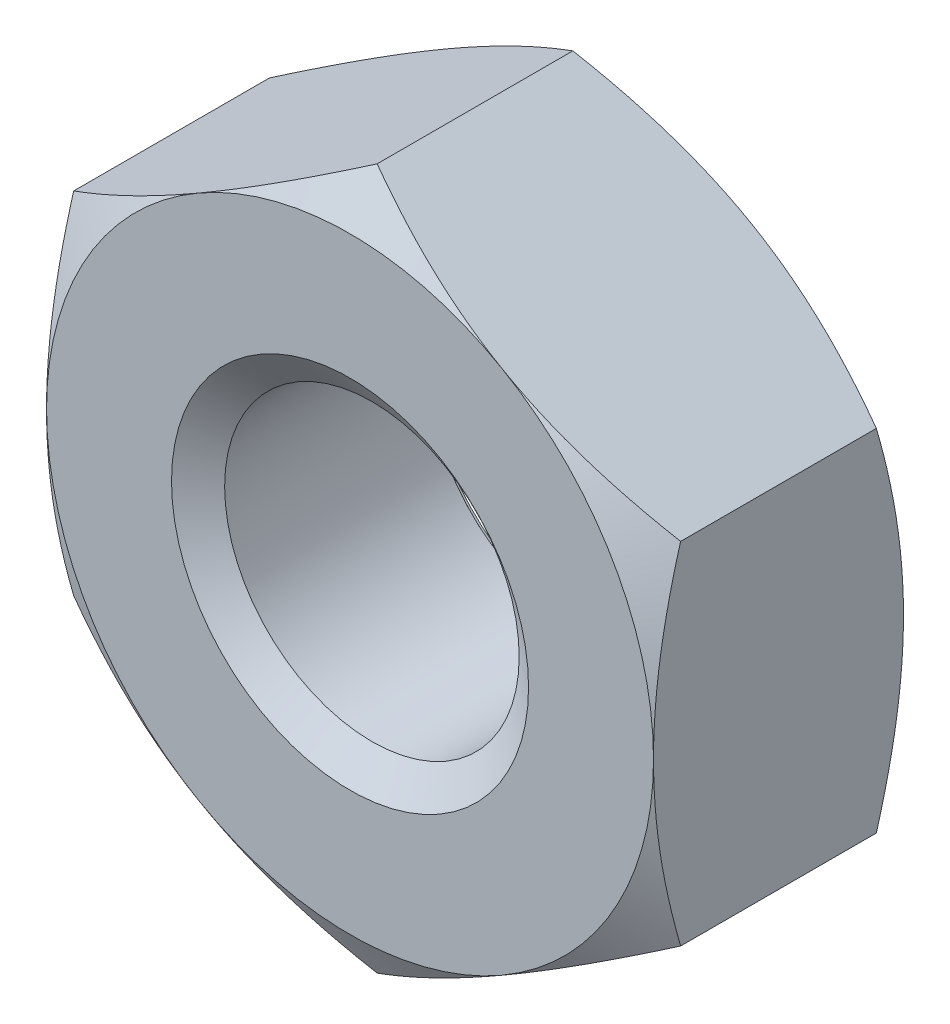
ISO-10303-21;
HEADER;
FILE_DESCRIPTION(('STEP AP214'),'2;1');
FILE_NAME('part.step','',(''),(''),'','','');
FILE_SCHEMA(('AUTOMOTIVE_DESIGN { 1 0 10303 214 1 1 1 1 }'));
ENDSEC;
DATA;
#1=APPLICATION_CONTEXT('core data for automotive mechanical design processes');
#2=APPLICATION_PROTOCOL_DEFINITION('international standard','automotive_design',2000,#1);
#3=PRODUCT_CONTEXT('',#1,'mechanical');
#4=PRODUCT('Part','Part','',(#3));
#5=PRODUCT_RELATED_PRODUCT_CATEGORY('part','',(#4));
#6=PRODUCT_DEFINITION_FORMATION('','',#4);
#7=PRODUCT_DEFINITION_CONTEXT('part definition',#1,'design');
#8=PRODUCT_DEFINITION('design','',#6,#7);
#9=PRODUCT_DEFINITION_SHAPE('','',#8);
#10=(LENGTH_UNIT() NAMED_UNIT(*) SI_UNIT(.MILLI.,.METRE.));
#11=(NAMED_UNIT(*) PLANE_ANGLE_UNIT() SI_UNIT($,.RADIAN.));
#12=(NAMED_UNIT(*) SI_UNIT($,.STERADIAN.) SOLID_ANGLE_UNIT());
#13=UNCERTAINTY_MEASURE_WITH_UNIT(LENGTH_MEASURE(1.E-05),#10,'distance_accuracy_value','');
#14=(GEOMETRIC_REPRESENTATION_CONTEXT(3) GLOBAL_UNCERTAINTY_ASSIGNED_CONTEXT((#13)) GLOBAL_UNIT_ASSIGNED_CONTEXT((#10,
#11,#12)) REPRESENTATION_CONTEXT('',''));
#15=CARTESIAN_POINT('',(0.,0.,0.));
#16=DIRECTION('',(0.,0.,1.));
#17=DIRECTION('',(1.,0.,0.));
#18=AXIS2_PLACEMENT_3D('',#15,#16,#17);
#19=CARTESIAN_POINT('',(0.,3.92598183048946,-2.8));
#20=DIRECTION('',(0.,0.,-1.));
#21=DIRECTION('',(-1.,0.,0.));
#22=AXIS2_PLACEMENT_3D('',#19,#20,#21);
#23=PLANE('',#22);
#24=CARTESIAN_POINT('',(0.,0.,-2.8));
#25=DIRECTION('',(0.,0.,-1.));
#26=DIRECTION('',(-1.,0.,0.));
#27=AXIS2_PLACEMENT_3D('',#24,#25,#26);
#28=CIRCLE('',#27,2.);
#29=CARTESIAN_POINT('',(-2.,0.,-2.8));
#30=VERTEX_POINT('',#29);
#31=EDGE_CURVE('E698',#30,#30,#28,.T.);
#32=ORIENTED_EDGE('',*,*,#31,.F.);
#33=EDGE_LOOP('',(#32));
#34=FACE_BOUND('',#33,.T.);
#35=CARTESIAN_POINT('',(0.,0.,-2.8));
#36=DIRECTION('',(0.,0.,-1.));
#37=DIRECTION('',(-1.,0.,0.));
#38=AXIS2_PLACEMENT_3D('',#35,#36,#37);
#39=CIRCLE('',#38,3.4);
#40=CARTESIAN_POINT('',(-3.4,0.,-2.8));
#41=VERTEX_POINT('',#40);
#42=CARTESIAN_POINT('',(-1.7,-2.94448637286709,-2.8));
#43=VERTEX_POINT('',#42);
#44=EDGE_CURVE('E185',#41,#43,#39,.F.);
#45=ORIENTED_EDGE('',*,*,#44,.F.);
#46=CARTESIAN_POINT('',(-1.7,2.94448637286709,-2.8));
#47=VERTEX_POINT('',#46);
#48=EDGE_CURVE('E160',#47,#41,#39,.F.);
#49=ORIENTED_EDGE('',*,*,#48,.F.);
#50=CARTESIAN_POINT('',(1.7,2.94448637286709,-2.8));
#51=VERTEX_POINT('',#50);
#52=EDGE_CURVE('E653',#51,#47,#39,.F.);
#53=ORIENTED_EDGE('',*,*,#52,.F.);
#54=CARTESIAN_POINT('',(0.,0.,-2.8));
#55=DIRECTION('',(0.,0.,1.));
#56=DIRECTION('',(1.,0.,0.));
#57=AXIS2_PLACEMENT_3D('',#54,#55,#56);
#58=CIRCLE('',#57,3.4);
#59=CARTESIAN_POINT('',(3.4,0.,-2.8));
#60=VERTEX_POINT('',#59);
#61=EDGE_CURVE('E651',#60,#51,#58,.T.);
#62=ORIENTED_EDGE('',*,*,#61,.F.);
#63=CARTESIAN_POINT('',(1.7,-2.94448637286709,-2.8));
#64=VERTEX_POINT('',#63);
#65=EDGE_CURVE('E645',#64,#60,#39,.F.);
#66=ORIENTED_EDGE('',*,*,#65,.F.);
#67=EDGE_CURVE('E648',#43,#64,#39,.F.);
#68=ORIENTED_EDGE('',*,*,#67,.F.);
#69=EDGE_LOOP('',(#45,#49,#53,#62,#66,#68));
#70=FACE_BOUND('',#69,.T.);
#71=ADVANCED_FACE('F39',(#34,#70),#23,.T.);
#72=CARTESIAN_POINT('',(0.,3.92598183048946,0.));
#73=DIRECTION('',(0.,0.,-1.));
#74=DIRECTION('',(-1.,0.,0.));
#75=AXIS2_PLACEMENT_3D('',#72,#73,#74);
#76=PLANE('',#75);
#77=CARTESIAN_POINT('',(0.,0.,0.));
#78=DIRECTION('',(0.,0.,-1.));
#79=DIRECTION('',(-1.,0.,0.));
#80=AXIS2_PLACEMENT_3D('',#77,#78,#79);
#81=CIRCLE('',#80,2.00000000000002);
#82=CARTESIAN_POINT('',(-2.00000000000002,0.,0.));
#83=VERTEX_POINT('',#82);
#84=EDGE_CURVE('E47',#83,#83,#81,.T.);
#85=ORIENTED_EDGE('',*,*,#84,.T.);
#86=EDGE_LOOP('',(#85));
#87=FACE_BOUND('',#86,.T.);
#88=CARTESIAN_POINT('',(0.,0.,0.));
#89=DIRECTION('',(0.,0.,-1.));
#90=DIRECTION('',(-1.,0.,0.));
#91=AXIS2_PLACEMENT_3D('',#88,#89,#90);
#92=CIRCLE('',#91,3.4);
#93=CARTESIAN_POINT('',(-3.4,0.,0.));
#94=VERTEX_POINT('',#93);
#95=CARTESIAN_POINT('',(-1.7,2.94448637286709,0.));
#96=VERTEX_POINT('',#95);
#97=EDGE_CURVE('E186',#94,#96,#92,.T.);
#98=ORIENTED_EDGE('',*,*,#97,.F.);
#99=CARTESIAN_POINT('',(-1.7,-2.94448637286709,0.));
#100=VERTEX_POINT('',#99);
#101=EDGE_CURVE('E179',#100,#94,#92,.T.);
#102=ORIENTED_EDGE('',*,*,#101,.F.);
#103=CARTESIAN_POINT('',(1.7,-2.94448637286709,0.));
#104=VERTEX_POINT('',#103);
#105=EDGE_CURVE('E184',#104,#100,#92,.T.);
#106=ORIENTED_EDGE('',*,*,#105,.F.);
#107=CARTESIAN_POINT('',(3.4,0.,0.));
#108=VERTEX_POINT('',#107);
#109=EDGE_CURVE('E709',#108,#104,#92,.T.);
#110=ORIENTED_EDGE('',*,*,#109,.F.);
#111=CARTESIAN_POINT('',(0.,0.,0.));
#112=DIRECTION('',(0.,0.,1.));
#113=DIRECTION('',(1.,0.,0.));
#114=AXIS2_PLACEMENT_3D('',#111,#112,#113);
#115=CIRCLE('',#114,3.4);
#116=CARTESIAN_POINT('',(1.7,2.94448637286709,0.));
#117=VERTEX_POINT('',#116);
#118=EDGE_CURVE('E130',#108,#117,#115,.T.);
#119=ORIENTED_EDGE('',*,*,#118,.T.);
#120=EDGE_CURVE('E706',#96,#117,#92,.T.);
#121=ORIENTED_EDGE('',*,*,#120,.F.);
#122=EDGE_LOOP('',(#98,#102,#106,#110,#119,#121));
#123=FACE_BOUND('',#122,.T.);
#124=ADVANCED_FACE('F306',(#87,#123),#76,.F.);
#125=CARTESIAN_POINT('',(0.,3.92598183048946,-2.8));
#126=DIRECTION('',(-0.5,0.866025403784438,0.));
#127=DIRECTION('',(-0.866025403784438,-0.5,0.));
#128=AXIS2_PLACEMENT_3D('',#125,#126,#127);
#129=PLANE('',#128);
#130=DIRECTION('',(0.,0.,1.));
#131=VECTOR('',#130,1.);
#132=CARTESIAN_POINT('',(-3.4,1.96299091524472,-2.8));
#133=LINE('',#132,#131);
#134=CARTESIAN_POINT('',(-3.4,1.96299091524473,-2.49632424857806));
#135=VERTEX_POINT('',#134);
#136=CARTESIAN_POINT('',(-3.4,1.96299091524472,-0.303675751421939));
#137=VERTEX_POINT('',#136);
#138=EDGE_CURVE('E613',#135,#137,#133,.T.);
#139=ORIENTED_EDGE('',*,*,#138,.T.);
#140=CARTESIAN_POINT('',(-3.4002,1.96287544519089,-0.303742421029696));
#141=CARTESIAN_POINT('',(-3.250787215921,2.04913895629927,-0.253919372071098));
#142=CARTESIAN_POINT('',(-3.10008471026262,2.13614708850869,-0.208607080299957));
#143=CARTESIAN_POINT('',(-2.79607011074045,2.3116699993804,-0.129513916503994));
#144=CARTESIAN_POINT('',(-2.64275261484591,2.40018789690658,-0.0957610249088725));
#145=CARTESIAN_POINT('',(-2.33801771128028,2.57612667551168,-0.0432195895766767));
#146=CARTESIAN_POINT('',(-2.18664719158963,2.66352048580245,-0.0240813572211267));
#147=CARTESIAN_POINT('',(-1.88319387878141,2.83871933763876,-0.00123403466815952));
#148=CARTESIAN_POINT('',(-1.73111218868187,2.92652374235653,0.00249397481833436));
#149=CARTESIAN_POINT('',(-1.44693750452881,3.09059207274918,-0.00526034767193921));
#150=CARTESIAN_POINT('',(-1.31480197704328,3.16688055511247,-0.0148387300903146));
#151=CARTESIAN_POINT('',(-1.05139178677687,3.31896049937008,-0.045196962120329));
#152=CARTESIAN_POINT('',(-0.920118035124447,3.39475143522413,-0.0659871828008287));
#153=CARTESIAN_POINT('',(-0.656164714666519,3.54714495584401,-0.117961276474051));
#154=CARTESIAN_POINT('',(-0.523518554476464,3.62372825213671,-0.149365472606075));
#155=CARTESIAN_POINT('',(-0.260204655545891,3.77575260256565,-0.220640706067343));
#156=CARTESIAN_POINT('',(-0.129533543191688,3.85119560445865,-0.260494995451308));
#157=CARTESIAN_POINT('',(0.000199999999998636,3.92609730054329,-0.303742421029698));
#158=B_SPLINE_CURVE_WITH_KNOTS('',3,(#140,#141,#142,#143,#144,#145,#146,#147,#148,#149,#150,
#151,#152,#153,#154,#155,#156,#157),.UNSPECIFIED.,.F.,.F.,(4,2,2,2,2,2,2,2,4),(0.,
0.538943032327117,1.07918154733641,1.60604929058082,2.13227000041338,2.59046591943176,
3.04908640333113,3.51788004492528,3.98575308856158),.UNSPECIFIED.);
#159=EDGE_CURVE('E136',#137,#96,#158,.T.);
#160=ORIENTED_EDGE('',*,*,#159,.T.);
#161=CARTESIAN_POINT('',(0.,3.92598183048946,-0.303675751421942));
#162=VERTEX_POINT('',#161);
#163=EDGE_CURVE('E54',#96,#162,#158,.T.);
#164=ORIENTED_EDGE('',*,*,#163,.T.);
#165=DIRECTION('',(0.,0.,1.));
#166=VECTOR('',#165,1.);
#167=CARTESIAN_POINT('',(0.,3.92598183048946,-2.8));
#168=LINE('',#167,#166);
#169=CARTESIAN_POINT('',(0.,3.92598183048946,-2.49632424857806));
#170=VERTEX_POINT('',#169);
#171=EDGE_CURVE('E154',#170,#162,#168,.T.);
#172=ORIENTED_EDGE('',*,*,#171,.F.);
#173=CARTESIAN_POINT('',(-3.4002,1.96287544519089,-2.4962575789703));
#174=CARTESIAN_POINT('',(-3.250787215921,2.04913895629927,-2.5460806279289));
#175=CARTESIAN_POINT('',(-3.10008471026262,2.13614708850869,-2.59139291970004));
#176=CARTESIAN_POINT('',(-2.79607011074044,2.3116699993804,-2.67048608349601));
#177=CARTESIAN_POINT('',(-2.64275261484591,2.40018789690658,-2.70423897509113));
#178=CARTESIAN_POINT('',(-2.33801771128028,2.57612667551168,-2.75678041042332));
#179=CARTESIAN_POINT('',(-2.18664719158963,2.66352048580245,-2.77591864277887));
#180=CARTESIAN_POINT('',(-1.88319387878141,2.83871933763876,-2.79876596533184));
#181=CARTESIAN_POINT('',(-1.73111218868187,2.92652374235653,-2.80249397481833));
#182=CARTESIAN_POINT('',(-1.44693750452881,3.09059207274918,-2.79473965232806));
#183=CARTESIAN_POINT('',(-1.31480197704328,3.16688055511247,-2.78516126990969));
#184=CARTESIAN_POINT('',(-1.05139178677687,3.31896049937008,-2.75480303787967));
#185=CARTESIAN_POINT('',(-0.920118035124447,3.39475143522413,-2.73401281719917));
#186=CARTESIAN_POINT('',(-0.656164714666519,3.54714495584401,-2.68203872352595));
#187=CARTESIAN_POINT('',(-0.523518554476464,3.62372825213671,-2.65063452739393));
#188=CARTESIAN_POINT('',(-0.260204655545891,3.77575260256565,-2.57935929393266));
#189=CARTESIAN_POINT('',(-0.129533543191687,3.85119560445865,-2.53950500454869));
#190=CARTESIAN_POINT('',(0.000199999999998626,3.92609730054329,-2.4962575789703));
#191=B_SPLINE_CURVE_WITH_KNOTS('',3,(#173,#174,#175,#176,#177,#178,#179,#180,#181,#182,#183,
#184,#185,#186,#187,#188,#189,#190),.UNSPECIFIED.,.F.,.F.,(4,2,2,2,2,2,2,2,4),(0.,
0.538943032327117,1.07918154733641,1.60604929058082,2.13227000041338,2.59046591943176,
3.04908640333113,3.51788004492528,3.98575308856158),.UNSPECIFIED.);
#192=EDGE_CURVE('E320',#47,#170,#191,.T.);
#193=ORIENTED_EDGE('',*,*,#192,.F.);
#194=EDGE_CURVE('E310',#135,#47,#191,.T.);
#195=ORIENTED_EDGE('',*,*,#194,.F.);
#196=EDGE_LOOP('',(#139,#160,#164,#172,#193,#195));
#197=FACE_BOUND('',#196,.T.);
#198=ADVANCED_FACE('F303',(#197),#129,.T.);
#199=CARTESIAN_POINT('',(3.4,1.96299091524472,-2.8));
#200=DIRECTION('',(0.5,0.866025403784438,0.));
#201=DIRECTION('',(-0.866025403784438,0.5,0.));
#202=AXIS2_PLACEMENT_3D('',#199,#200,#201);
#203=PLANE('',#202);
#204=ORIENTED_EDGE('',*,*,#171,.T.);
#205=CARTESIAN_POINT('',(-0.000200000000001463,3.92609730054329,-0.303742421029699));
#206=CARTESIAN_POINT('',(0.149212784078997,3.83983378943491,-0.253919372071097));
#207=CARTESIAN_POINT('',(0.299915289737384,3.75282565722549,-0.208607080299955));
#208=CARTESIAN_POINT('',(0.603929889259557,3.57730274635379,-0.129513916503991));
#209=CARTESIAN_POINT('',(0.757247385154087,3.4887848488276,-0.0957610249088698));
#210=CARTESIAN_POINT('',(1.06198228871972,3.31284607022251,-0.0432195895766734));
#211=CARTESIAN_POINT('',(1.21335280841038,3.22545225993173,-0.0240813572211222));
#212=CARTESIAN_POINT('',(1.51680612121859,3.05025340809543,-0.00123403466815707));
#213=CARTESIAN_POINT('',(1.66888781131813,2.96244900337765,0.00249397481833351));
#214=CARTESIAN_POINT('',(1.95306249547119,2.798380672985,-0.00526034767193952));
#215=CARTESIAN_POINT('',(2.08519802295673,2.72209219062171,-0.0148387300903119));
#216=CARTESIAN_POINT('',(2.34860821322314,2.57001224636411,-0.0451969621203242));
#217=CARTESIAN_POINT('',(2.47988196487556,2.49422131051005,-0.0659871828008248));
#218=CARTESIAN_POINT('',(2.74383528533348,2.34182778989017,-0.117961276474048));
#219=CARTESIAN_POINT('',(2.87648144552354,2.26524449359747,-0.149365472606071));
#220=CARTESIAN_POINT('',(3.13979534445411,2.11322014316854,-0.22064070606734));
#221=CARTESIAN_POINT('',(3.27046645680831,2.03777714127553,-0.260494995451305));
#222=CARTESIAN_POINT('',(3.4002,1.96287544519089,-0.303742421029697));
#223=B_SPLINE_CURVE_WITH_KNOTS('',3,(#205,#206,#207,#208,#209,#210,#211,#212,#213,#214,#215,
#216,#217,#218,#219,#220,#221,#222),.UNSPECIFIED.,.F.,.F.,(4,2,2,2,2,2,2,2,4),(0.,
0.538943032327118,1.07918154733641,1.60604929058082,2.13227000041338,2.59046591943176,
3.04908640333113,3.51788004492528,3.98575308856158),.UNSPECIFIED.);
#224=EDGE_CURVE('E146',#162,#117,#223,.T.);
#225=ORIENTED_EDGE('',*,*,#224,.T.);
#226=CARTESIAN_POINT('',(3.4,1.96299091524473,-0.303675751421942));
#227=VERTEX_POINT('',#226);
#228=EDGE_CURVE('E62',#117,#227,#223,.T.);
#229=ORIENTED_EDGE('',*,*,#228,.T.);
#230=DIRECTION('',(0.,0.,1.));
#231=VECTOR('',#230,1.);
#232=CARTESIAN_POINT('',(3.4,1.96299091524472,-2.8));
#233=LINE('',#232,#231);
#234=CARTESIAN_POINT('',(3.4,1.96299091524473,-2.49632424857806));
#235=VERTEX_POINT('',#234);
#236=EDGE_CURVE('E145',#235,#227,#233,.T.);
#237=ORIENTED_EDGE('',*,*,#236,.F.);
#238=CARTESIAN_POINT('',(-0.000200000000001463,3.92609730054329,-2.4962575789703));
#239=CARTESIAN_POINT('',(0.149212784078997,3.83983378943491,-2.5460806279289));
#240=CARTESIAN_POINT('',(0.299915289737384,3.75282565722549,-2.59139291970004));
#241=CARTESIAN_POINT('',(0.603929889259556,3.57730274635379,-2.67048608349601));
#242=CARTESIAN_POINT('',(0.757247385154087,3.4887848488276,-2.70423897509113));
#243=CARTESIAN_POINT('',(1.06198228871972,3.31284607022251,-2.75678041042333));
#244=CARTESIAN_POINT('',(1.21335280841038,3.22545225993173,-2.77591864277888));
#245=CARTESIAN_POINT('',(1.51680612121859,3.05025340809543,-2.79876596533184));
#246=CARTESIAN_POINT('',(1.66888781131813,2.96244900337765,-2.80249397481833));
#247=CARTESIAN_POINT('',(1.95306249547119,2.798380672985,-2.79473965232806));
#248=CARTESIAN_POINT('',(2.08519802295673,2.72209219062171,-2.78516126990969));
#249=CARTESIAN_POINT('',(2.34860821322314,2.57001224636411,-2.75480303787968));
#250=CARTESIAN_POINT('',(2.47988196487556,2.49422131051005,-2.73401281719918));
#251=CARTESIAN_POINT('',(2.74383528533348,2.34182778989017,-2.68203872352595));
#252=CARTESIAN_POINT('',(2.87648144552354,2.26524449359747,-2.65063452739393));
#253=CARTESIAN_POINT('',(3.13979534445411,2.11322014316854,-2.57935929393266));
#254=CARTESIAN_POINT('',(3.27046645680831,2.03777714127553,-2.5395050045487));
#255=CARTESIAN_POINT('',(3.4002,1.96287544519089,-2.4962575789703));
#256=B_SPLINE_CURVE_WITH_KNOTS('',3,(#238,#239,#240,#241,#242,#243,#244,#245,#246,#247,#248,
#249,#250,#251,#252,#253,#254,#255),.UNSPECIFIED.,.F.,.F.,(4,2,2,2,2,2,2,2,4),(0.,
0.538943032327118,1.07918154733641,1.60604929058082,2.13227000041338,2.59046591943176,
3.04908640333113,3.51788004492528,3.98575308856158),.UNSPECIFIED.);
#257=EDGE_CURVE('E327',#51,#235,#256,.T.);
#258=ORIENTED_EDGE('',*,*,#257,.F.);
#259=EDGE_CURVE('E625',#170,#51,#256,.T.);
#260=ORIENTED_EDGE('',*,*,#259,.F.);
#261=EDGE_LOOP('',(#204,#225,#229,#237,#258,#260));
#262=FACE_BOUND('',#261,.T.);
#263=ADVANCED_FACE('F143',(#262),#203,.T.);
#264=CARTESIAN_POINT('',(3.4,1.96299091524472,-2.8));
#265=DIRECTION('',(-1.,0.,0.));
#266=DIRECTION('',(0.,0.,1.));
#267=AXIS2_PLACEMENT_3D('',#264,#265,#266);
#268=PLANE('',#267);
#269=CARTESIAN_POINT('',(3.4,-5.20614119146508,-1.62699079805455));
#270=CARTESIAN_POINT('',(3.4,-5.05686196482875,-1.55485083015187));
#271=CARTESIAN_POINT('',(3.4,-4.90722979280993,-1.48342799323629));
#272=CARTESIAN_POINT('',(3.4,-4.60706872061261,-1.34242637477759));
#273=CARTESIAN_POINT('',(3.4,-4.45653967062938,-1.27284791251215));
#274=CARTESIAN_POINT('',(3.4,-4.15358085933384,-1.13557829359977));
#275=CARTESIAN_POINT('',(3.4,-4.00114515055958,-1.06790021580358));
#276=CARTESIAN_POINT('',(3.4,-3.69502084535174,-0.935450997607252));
#277=CARTESIAN_POINT('',(3.4,-3.54133231472007,-0.870679705681816));
#278=CARTESIAN_POINT('',(3.4,-3.23055000733231,-0.744048052835207));
#279=CARTESIAN_POINT('',(3.4,-3.07343758899354,-0.682233191583468));
#280=CARTESIAN_POINT('',(3.4,-2.75735959775723,-0.563444796315506));
#281=CARTESIAN_POINT('',(3.4,-2.59839382091431,-0.506471800931528));
#282=CARTESIAN_POINT('',(3.4,-2.27868270515705,-0.398897986166249));
#283=CARTESIAN_POINT('',(3.4,-2.11794197155921,-0.348283619566261));
#284=CARTESIAN_POINT('',(3.4,-1.79417536440473,-0.25507085306283));
#285=CARTESIAN_POINT('',(3.4,-1.63115023107886,-0.212469918225239));
#286=CARTESIAN_POINT('',(3.4,-1.3027034779347,-0.137352175710936));
#287=CARTESIAN_POINT('',(3.4,-1.13728123226902,-0.104838053063059));
#288=CARTESIAN_POINT('',(3.4,-0.804442316991671,-0.0520831005339918));
#289=CARTESIAN_POINT('',(3.4,-0.637025645616808,-0.0318422815039441));
#290=CARTESIAN_POINT('',(3.4,-0.302134191183751,-0.00542454117702103));
#291=CARTESIAN_POINT('',(3.4,-0.134666614429909,0.000841415646884893));
#292=CARTESIAN_POINT('',(3.4,0.200151272766349,-0.00102345641857649));
#293=CARTESIAN_POINT('',(3.4,0.367501602365375,-0.00915054819304825));
#294=CARTESIAN_POINT('',(3.4,0.65327653994169,-0.0347469244215523));
#295=CARTESIAN_POINT('',(3.4,0.772016425624547,-0.0488829016373237));
#296=CARTESIAN_POINT('',(3.4,1.00857896703973,-0.0834813987946884));
#297=CARTESIAN_POINT('',(3.4,1.12640147510861,-0.10394491649968));
#298=CARTESIAN_POINT('',(3.4,1.47839688635024,-0.173752810307696));
#299=CARTESIAN_POINT('',(3.4,1.71091986949414,-0.231496553461381));
#300=CARTESIAN_POINT('',(3.4,2.05885515062345,-0.331088905419623));
#301=CARTESIAN_POINT('',(3.4,2.17608105907308,-0.36695685053989));
#302=CARTESIAN_POINT('',(3.4,2.40930935236193,-0.442241893193597));
#303=CARTESIAN_POINT('',(3.4,2.52531252030024,-0.481656542758875));
#304=CARTESIAN_POINT('',(3.4,2.75561024438889,-0.563214844303243));
#305=CARTESIAN_POINT('',(3.4,2.86991074254812,-0.605341886890474));
#306=CARTESIAN_POINT('',(3.4,3.09762491979977,-0.692068600722095));
#307=CARTESIAN_POINT('',(3.4,3.21103821903479,-0.736669271318863));
#308=CARTESIAN_POINT('',(3.4,3.32404144138681,-0.782262655560525));
#309=B_SPLINE_CURVE_WITH_KNOTS('',3,(#269,#270,#271,#272,#273,#274,#275,#276,#277,#278,#279,
#280,#281,#282,#283,#284,#285,#286,#287,#288,#289,#290,#291,#292,#293,#294,#295,#296,#297,#298,
#299,#300,#301,#302,#303,#304,#305,#306,#307,#308),.UNSPECIFIED.,.F.,.F.,(4,2,2,2,2,2,2,2,2,2,2,
2,2,2,2,2,2,2,2,4),(0.,0.49739602365243,0.994877596009379,1.49520605449091,1.99550840142103,
2.50195290847861,3.00845368129086,3.5138563499296,4.0190988718275,4.52447577007668,
5.02985311514191,5.53200132975931,6.03401918210903,6.39257919701693,6.75119578061214,
7.46896267655855,7.83670489613036,8.20419521548853,8.56961705243524,8.93518761169598),.UNSPECIFIED.);
#310=CARTESIAN_POINT('',(3.4,-1.96299091524473,-0.303675751421942));
#311=VERTEX_POINT('',#310);
#312=EDGE_CURVE('E138',#311,#108,#309,.T.);
#313=ORIENTED_EDGE('',*,*,#312,.F.);
#314=DIRECTION('',(0.,0.,1.));
#315=VECTOR('',#314,1.);
#316=CARTESIAN_POINT('',(3.4,-1.96299091524473,-2.8));
#317=LINE('',#316,#315);
#318=CARTESIAN_POINT('',(3.4,-1.96299091524473,-2.49632424857806));
#319=VERTEX_POINT('',#318);
#320=EDGE_CURVE('E155',#319,#311,#317,.T.);
#321=ORIENTED_EDGE('',*,*,#320,.F.);
#322=CARTESIAN_POINT('',(3.4,-5.20614119146508,-1.17300920194545));
#323=CARTESIAN_POINT('',(3.4,-5.05686196482875,-1.24514916984813));
#324=CARTESIAN_POINT('',(3.4,-4.90722979280993,-1.31657200676371));
#325=CARTESIAN_POINT('',(3.4,-4.60706872061261,-1.45757362522241));
#326=CARTESIAN_POINT('',(3.4,-4.45653967062939,-1.52715208748785));
#327=CARTESIAN_POINT('',(3.4,-4.15358085933384,-1.66442170640023));
#328=CARTESIAN_POINT('',(3.4,-4.00114515055958,-1.73209978419642));
#329=CARTESIAN_POINT('',(3.4,-3.69502084535174,-1.86454900239275));
#330=CARTESIAN_POINT('',(3.4,-3.54133231472007,-1.92932029431818));
#331=CARTESIAN_POINT('',(3.4,-3.23055000733231,-2.05595194716479));
#332=CARTESIAN_POINT('',(3.4,-3.07343758899354,-2.11776680841653));
#333=CARTESIAN_POINT('',(3.4,-2.75735959775723,-2.23655520368449));
#334=CARTESIAN_POINT('',(3.4,-2.59839382091431,-2.29352819906847));
#335=CARTESIAN_POINT('',(3.4,-2.27868270515705,-2.40110201383375));
#336=CARTESIAN_POINT('',(3.4,-2.11794197155921,-2.45171638043374));
#337=CARTESIAN_POINT('',(3.4,-1.79417536440473,-2.54492914693717));
#338=CARTESIAN_POINT('',(3.4,-1.63115023107886,-2.58753008177476));
#339=CARTESIAN_POINT('',(3.4,-1.3027034779347,-2.66264782428906));
#340=CARTESIAN_POINT('',(3.4,-1.13728123226902,-2.69516194693694));
#341=CARTESIAN_POINT('',(3.4,-0.804442316991671,-2.74791689946601));
#342=CARTESIAN_POINT('',(3.4,-0.637025645616808,-2.76815771849606));
#343=CARTESIAN_POINT('',(3.4,-0.302134191183751,-2.79457545882298));
#344=CARTESIAN_POINT('',(3.4,-0.134666614429909,-2.80084141564688));
#345=CARTESIAN_POINT('',(3.4,0.200151272766349,-2.79897654358142));
#346=CARTESIAN_POINT('',(3.4,0.367501602365375,-2.79084945180695));
#347=CARTESIAN_POINT('',(3.4,0.65327653994169,-2.76525307557845));
#348=CARTESIAN_POINT('',(3.4,0.772016425624547,-2.75111709836268));
#349=CARTESIAN_POINT('',(3.4,1.00857896703973,-2.71651860120531));
#350=CARTESIAN_POINT('',(3.4,1.12640147510861,-2.69605508350032));
#351=CARTESIAN_POINT('',(3.4,1.47839688635024,-2.6262471896923));
#352=CARTESIAN_POINT('',(3.4,1.71091986949414,-2.56850344653862));
#353=CARTESIAN_POINT('',(3.4,2.05885515062345,-2.46891109458038));
#354=CARTESIAN_POINT('',(3.4,2.17608105907308,-2.43304314946011));
#355=CARTESIAN_POINT('',(3.4,2.40930935236193,-2.3577581068064));
#356=CARTESIAN_POINT('',(3.4,2.52531252030024,-2.31834345724113));
#357=CARTESIAN_POINT('',(3.4,2.75561024438889,-2.23678515569676));
#358=CARTESIAN_POINT('',(3.4,2.86991074254812,-2.19465811310953));
#359=CARTESIAN_POINT('',(3.4,3.09762491979976,-2.1079313992779));
#360=CARTESIAN_POINT('',(3.4,3.21103821903479,-2.06333072868114));
#361=CARTESIAN_POINT('',(3.4,3.32404144138681,-2.01773734443947));
#362=B_SPLINE_CURVE_WITH_KNOTS('',3,(#322,#323,#324,#325,#326,#327,#328,#329,#330,#331,#332,
#333,#334,#335,#336,#337,#338,#339,#340,#341,#342,#343,#344,#345,#346,#347,#348,#349,#350,#351,
#352,#353,#354,#355,#356,#357,#358,#359,#360,#361),.UNSPECIFIED.,.F.,.F.,(4,2,2,2,2,2,2,2,2,2,2,
2,2,2,2,2,2,2,2,4),(0.,0.497396023652429,0.994877596009378,1.49520605449091,1.99550840142103,
2.50195290847861,3.00845368129086,3.5138563499296,4.0190988718275,4.52447577007668,
5.02985311514191,5.53200132975931,6.03401918210903,6.39257919701693,6.75119578061214,
7.46896267655855,7.83670489613035,8.20419521548852,8.56961705243524,8.93518761169598),.UNSPECIFIED.);
#363=EDGE_CURVE('E319',#319,#60,#362,.T.);
#364=ORIENTED_EDGE('',*,*,#363,.T.);
#365=EDGE_CURVE('E152',#60,#235,#362,.T.);
#366=ORIENTED_EDGE('',*,*,#365,.T.);
#367=ORIENTED_EDGE('',*,*,#236,.T.);
#368=EDGE_CURVE('E127',#108,#227,#309,.T.);
#369=ORIENTED_EDGE('',*,*,#368,.F.);
#370=EDGE_LOOP('',(#313,#321,#364,#366,#367,#369));
#371=FACE_BOUND('',#370,.T.);
#372=ADVANCED_FACE('F150',(#371),#268,.F.);
#373=CARTESIAN_POINT('',(0.,-3.92598183048947,-2.8));
#374=DIRECTION('',(0.5,-0.866025403784438,0.));
#375=DIRECTION('',(0.866025403784438,0.5,0.));
#376=AXIS2_PLACEMENT_3D('',#373,#374,#375);
#377=PLANE('',#376);
#378=ORIENTED_EDGE('',*,*,#320,.T.);
#379=CARTESIAN_POINT('',(3.4002,-1.9628754451909,-0.303742421029698));
#380=CARTESIAN_POINT('',(3.250787215921,-2.04913895629928,-0.253919372071099));
#381=CARTESIAN_POINT('',(3.10008471026262,-2.1361470885087,-0.208607080299958));
#382=CARTESIAN_POINT('',(2.79607011074044,-2.3116699993804,-0.129513916503995));
#383=CARTESIAN_POINT('',(2.64275261484591,-2.40018789690659,-0.0957610249088742));
#384=CARTESIAN_POINT('',(2.33801771128027,-2.57612667551169,-0.0432195895766787));
#385=CARTESIAN_POINT('',(2.18664719158962,-2.66352048580246,-0.0240813572211285));
#386=CARTESIAN_POINT('',(1.88319387878141,-2.83871933763876,-0.00123403466816249));
#387=CARTESIAN_POINT('',(1.73111218868187,-2.92652374235654,0.00249397481833004));
#388=CARTESIAN_POINT('',(1.44693750452881,-3.09059207274919,-0.00526034767194353));
#389=CARTESIAN_POINT('',(1.31480197704327,-3.16688055511248,-0.0148387300903179));
#390=CARTESIAN_POINT('',(1.05139178677686,-3.31896049937008,-0.0451969621203317));
#391=CARTESIAN_POINT('',(0.920118035124445,-3.39475143522414,-0.0659871828008319));
#392=CARTESIAN_POINT('',(0.656164714666517,-3.54714495584402,-0.117961276474054));
#393=CARTESIAN_POINT('',(0.523518554476461,-3.62372825213672,-0.149365472606078));
#394=CARTESIAN_POINT('',(0.260204655545889,-3.77575260256565,-0.220640706067347));
#395=CARTESIAN_POINT('',(0.129533543191686,-3.85119560445866,-0.260494995451312));
#396=CARTESIAN_POINT('',(-0.00019999999999909,-3.9260973005433,-0.303742421029703));
#397=B_SPLINE_CURVE_WITH_KNOTS('',3,(#379,#380,#381,#382,#383,#384,#385,#386,#387,#388,#389,
#390,#391,#392,#393,#394,#395,#396),.UNSPECIFIED.,.F.,.F.,(4,2,2,2,2,2,2,2,4),(0.,
0.538943032327117,1.07918154733641,1.60604929058082,2.13227000041338,2.59046591943176,
3.04908640333113,3.51788004492528,3.98575308856158),.UNSPECIFIED.);
#398=EDGE_CURVE('E677',#311,#104,#397,.T.);
#399=ORIENTED_EDGE('',*,*,#398,.T.);
#400=CARTESIAN_POINT('',(0.,-3.92598183048946,-0.303675751421942));
#401=VERTEX_POINT('',#400);
#402=EDGE_CURVE('E275',#104,#401,#397,.T.);
#403=ORIENTED_EDGE('',*,*,#402,.T.);
#404=DIRECTION('',(0.,0.,1.));
#405=VECTOR('',#404,1.);
#406=CARTESIAN_POINT('',(0.,-3.92598183048947,-2.8));
#407=LINE('',#406,#405);
#408=CARTESIAN_POINT('',(0.,-3.92598183048946,-2.49632424857806));
#409=VERTEX_POINT('',#408);
#410=EDGE_CURVE('E163',#409,#401,#407,.T.);
#411=ORIENTED_EDGE('',*,*,#410,.F.);
#412=CARTESIAN_POINT('',(3.4002,-1.9628754451909,-2.4962575789703));
#413=CARTESIAN_POINT('',(3.250787215921,-2.04913895629928,-2.5460806279289));
#414=CARTESIAN_POINT('',(3.10008471026262,-2.1361470885087,-2.59139291970004));
#415=CARTESIAN_POINT('',(2.79607011074044,-2.3116699993804,-2.670486083496));
#416=CARTESIAN_POINT('',(2.64275261484591,-2.40018789690659,-2.70423897509113));
#417=CARTESIAN_POINT('',(2.33801771128028,-2.57612667551169,-2.75678041042332));
#418=CARTESIAN_POINT('',(2.18664719158962,-2.66352048580246,-2.77591864277887));
#419=CARTESIAN_POINT('',(1.88319387878141,-2.83871933763876,-2.79876596533184));
#420=CARTESIAN_POINT('',(1.73111218868187,-2.92652374235654,-2.80249397481833));
#421=CARTESIAN_POINT('',(1.44693750452881,-3.09059207274919,-2.79473965232806));
#422=CARTESIAN_POINT('',(1.31480197704327,-3.16688055511248,-2.78516126990968));
#423=CARTESIAN_POINT('',(1.05139178677686,-3.31896049937008,-2.75480303787967));
#424=CARTESIAN_POINT('',(0.920118035124445,-3.39475143522414,-2.73401281719917));
#425=CARTESIAN_POINT('',(0.656164714666517,-3.54714495584402,-2.68203872352595));
#426=CARTESIAN_POINT('',(0.523518554476461,-3.62372825213672,-2.65063452739392));
#427=CARTESIAN_POINT('',(0.260204655545888,-3.77575260256565,-2.57935929393265));
#428=CARTESIAN_POINT('',(0.129533543191685,-3.85119560445866,-2.53950500454869));
#429=CARTESIAN_POINT('',(-0.000199999999999092,-3.9260973005433,-2.49625757897029));
#430=B_SPLINE_CURVE_WITH_KNOTS('',3,(#412,#413,#414,#415,#416,#417,#418,#419,#420,#421,#422,
#423,#424,#425,#426,#427,#428,#429),.UNSPECIFIED.,.F.,.F.,(4,2,2,2,2,2,2,2,4),(0.,
0.538943032327117,1.07918154733641,1.60604929058082,2.13227000041338,2.59046591943176,
3.04908640333113,3.51788004492528,3.98575308856158),.UNSPECIFIED.);
#431=EDGE_CURVE('E347',#64,#409,#430,.T.);
#432=ORIENTED_EDGE('',*,*,#431,.F.);
#433=EDGE_CURVE('E355',#319,#64,#430,.T.);
#434=ORIENTED_EDGE('',*,*,#433,.F.);
#435=EDGE_LOOP('',(#378,#399,#403,#411,#432,#434));
#436=FACE_BOUND('',#435,.T.);
#437=ADVANCED_FACE('F367',(#436),#377,.T.);
#438=CARTESIAN_POINT('',(-3.4,-1.96299091524473,-2.8));
#439=DIRECTION('',(-0.5,-0.866025403784438,0.));
#440=DIRECTION('',(0.866025403784438,-0.5,0.));
#441=AXIS2_PLACEMENT_3D('',#438,#439,#440);
#442=PLANE('',#441);
#443=ORIENTED_EDGE('',*,*,#410,.T.);
#444=CARTESIAN_POINT('',(0.000200000000001142,-3.9260973005433,-0.303742421029703));
#445=CARTESIAN_POINT('',(-0.149212784078998,-3.83983378943492,-0.253919372071102));
#446=CARTESIAN_POINT('',(-0.299915289737385,-3.7528256572255,-0.20860708029996));
#447=CARTESIAN_POINT('',(-0.603929889259559,-3.5773027463538,-0.129513916503996));
#448=CARTESIAN_POINT('',(-0.757247385154089,-3.48878484882761,-0.0957610249088745));
#449=CARTESIAN_POINT('',(-1.06198228871973,-3.31284607022251,-0.0432195895766782));
#450=CARTESIAN_POINT('',(-1.21335280841038,-3.22545225993174,-0.0240813572211275));
#451=CARTESIAN_POINT('',(-1.5168061212186,-3.05025340809543,-0.00123403466816201));
#452=CARTESIAN_POINT('',(-1.66888781131814,-2.96244900337765,0.00249397481832944));
#453=CARTESIAN_POINT('',(-1.9530624954712,-2.798380672985,-0.00526034767194379));
#454=CARTESIAN_POINT('',(-2.08519802295673,-2.72209219062172,-0.0148387300903169));
#455=CARTESIAN_POINT('',(-2.34860821322314,-2.57001224636412,-0.0451969621203295));
#456=CARTESIAN_POINT('',(-2.47988196487556,-2.49422131051006,-0.0659871828008296));
#457=CARTESIAN_POINT('',(-2.74383528533349,-2.34182778989018,-0.117961276474052));
#458=CARTESIAN_POINT('',(-2.87648144552354,-2.26524449359748,-0.149365472606075));
#459=CARTESIAN_POINT('',(-3.13979534445411,-2.11322014316855,-0.220640706067343));
#460=CARTESIAN_POINT('',(-3.27046645680832,-2.03777714127554,-0.260494995451308));
#461=CARTESIAN_POINT('',(-3.4002,-1.9628754451909,-0.303742421029699));
#462=B_SPLINE_CURVE_WITH_KNOTS('',3,(#444,#445,#446,#447,#448,#449,#450,#451,#452,#453,#454,
#455,#456,#457,#458,#459,#460,#461),.UNSPECIFIED.,.F.,.F.,(4,2,2,2,2,2,2,2,4),(0.,
0.53894303232712,1.07918154733641,1.60604929058083,2.13227000041339,2.59046591943177,
3.04908640333113,3.51788004492529,3.98575308856158),.UNSPECIFIED.);
#463=EDGE_CURVE('E657',#401,#100,#462,.T.);
#464=ORIENTED_EDGE('',*,*,#463,.T.);
#465=CARTESIAN_POINT('',(-3.4,-1.96299091524473,-0.303675751421942));
#466=VERTEX_POINT('',#465);
#467=EDGE_CURVE('E245',#100,#466,#462,.T.);
#468=ORIENTED_EDGE('',*,*,#467,.T.);
#469=DIRECTION('',(0.,0.,1.));
#470=VECTOR('',#469,1.);
#471=CARTESIAN_POINT('',(-3.4,-1.96299091524473,-2.8));
#472=LINE('',#471,#470);
#473=CARTESIAN_POINT('',(-3.4,-1.96299091524473,-2.49632424857806));
#474=VERTEX_POINT('',#473);
#475=EDGE_CURVE('E605',#474,#466,#472,.T.);
#476=ORIENTED_EDGE('',*,*,#475,.F.);
#477=CARTESIAN_POINT('',(0.000200000000001128,-3.9260973005433,-2.49625757897029));
#478=CARTESIAN_POINT('',(-0.149212784078998,-3.83983378943492,-2.5460806279289));
#479=CARTESIAN_POINT('',(-0.299915289737385,-3.7528256572255,-2.59139291970004));
#480=CARTESIAN_POINT('',(-0.603929889259559,-3.5773027463538,-2.670486083496));
#481=CARTESIAN_POINT('',(-0.757247385154089,-3.48878484882761,-2.70423897509113));
#482=CARTESIAN_POINT('',(-1.06198228871973,-3.31284607022251,-2.75678041042332));
#483=CARTESIAN_POINT('',(-1.21335280841038,-3.22545225993174,-2.77591864277887));
#484=CARTESIAN_POINT('',(-1.5168061212186,-3.05025340809543,-2.79876596533184));
#485=CARTESIAN_POINT('',(-1.66888781131814,-2.96244900337765,-2.80249397481833));
#486=CARTESIAN_POINT('',(-1.9530624954712,-2.798380672985,-2.79473965232806));
#487=CARTESIAN_POINT('',(-2.08519802295673,-2.72209219062172,-2.78516126990968));
#488=CARTESIAN_POINT('',(-2.34860821322314,-2.57001224636412,-2.75480303787967));
#489=CARTESIAN_POINT('',(-2.47988196487556,-2.49422131051006,-2.73401281719917));
#490=CARTESIAN_POINT('',(-2.74383528533349,-2.34182778989018,-2.68203872352595));
#491=CARTESIAN_POINT('',(-2.87648144552354,-2.26524449359748,-2.65063452739392));
#492=CARTESIAN_POINT('',(-3.13979534445411,-2.11322014316855,-2.57935929393266));
#493=CARTESIAN_POINT('',(-3.27046645680832,-2.03777714127554,-2.53950500454869));
#494=CARTESIAN_POINT('',(-3.4002,-1.9628754451909,-2.4962575789703));
#495=B_SPLINE_CURVE_WITH_KNOTS('',3,(#477,#478,#479,#480,#481,#482,#483,#484,#485,#486,#487,
#488,#489,#490,#491,#492,#493,#494),.UNSPECIFIED.,.F.,.F.,(4,2,2,2,2,2,2,2,4),(0.,
0.53894303232712,1.07918154733641,1.60604929058083,2.13227000041339,2.59046591943177,
3.04908640333113,3.51788004492529,3.98575308856158),.UNSPECIFIED.);
#496=EDGE_CURVE('E357',#43,#474,#495,.T.);
#497=ORIENTED_EDGE('',*,*,#496,.F.);
#498=EDGE_CURVE('E356',#409,#43,#495,.T.);
#499=ORIENTED_EDGE('',*,*,#498,.F.);
#500=EDGE_LOOP('',(#443,#464,#468,#476,#497,#499));
#501=FACE_BOUND('',#500,.T.);
#502=ADVANCED_FACE('F370',(#501),#442,.T.);
#503=CARTESIAN_POINT('',(-3.4,1.96299091524472,-2.8));
#504=DIRECTION('',(-1.,0.,0.));
#505=DIRECTION('',(0.,0.,1.));
#506=AXIS2_PLACEMENT_3D('',#503,#504,#505);
#507=PLANE('',#506);
#508=ORIENTED_EDGE('',*,*,#475,.T.);
#509=CARTESIAN_POINT('',(-3.4,-5.20614119146509,-1.62699079805455));
#510=CARTESIAN_POINT('',(-3.4,-5.05686196482876,-1.55485083015187));
#511=CARTESIAN_POINT('',(-3.4,-4.90722979280994,-1.48342799323629));
#512=CARTESIAN_POINT('',(-3.4,-4.60706872061262,-1.34242637477759));
#513=CARTESIAN_POINT('',(-3.4,-4.45653967062939,-1.27284791251215));
#514=CARTESIAN_POINT('',(-3.4,-4.15358085933385,-1.13557829359978));
#515=CARTESIAN_POINT('',(-3.4,-4.00114515055959,-1.06790021580358));
#516=CARTESIAN_POINT('',(-3.4,-3.69502084535174,-0.935450997607255));
#517=CARTESIAN_POINT('',(-3.4,-3.54133231472008,-0.87067970568182));
#518=CARTESIAN_POINT('',(-3.4,-3.23055000733231,-0.74404805283521));
#519=CARTESIAN_POINT('',(-3.4,-3.07343758899355,-0.682233191583471));
#520=CARTESIAN_POINT('',(-3.4,-2.75735959775724,-0.563444796315509));
#521=CARTESIAN_POINT('',(-3.4,-2.59839382091431,-0.50647180093153));
#522=CARTESIAN_POINT('',(-3.4,-2.27868270515705,-0.398897986166251));
#523=CARTESIAN_POINT('',(-3.4,-2.11794197155922,-0.348283619566263));
#524=CARTESIAN_POINT('',(-3.4,-1.79417536440474,-0.255070853062831));
#525=CARTESIAN_POINT('',(-3.4,-1.63115023107887,-0.212469918225241));
#526=CARTESIAN_POINT('',(-3.4,-1.3027034779347,-0.137352175710937));
#527=CARTESIAN_POINT('',(-3.4,-1.13728123226903,-0.10483805306306));
#528=CARTESIAN_POINT('',(-3.4,-0.804442316991675,-0.0520831005339922));
#529=CARTESIAN_POINT('',(-3.4,-0.637025645616812,-0.0318422815039445));
#530=CARTESIAN_POINT('',(-3.4,-0.302134191183755,-0.00542454117702117));
#531=CARTESIAN_POINT('',(-3.4,-0.134666614429913,0.000841415646884983));
#532=CARTESIAN_POINT('',(-3.4,0.200151272766345,-0.00102345641857608));
#533=CARTESIAN_POINT('',(-3.4,0.367501602365371,-0.00915054819304773));
#534=CARTESIAN_POINT('',(-3.4,0.653276539941685,-0.0347469244215518));
#535=CARTESIAN_POINT('',(-3.4,0.772016425624543,-0.0488829016373232));
#536=CARTESIAN_POINT('',(-3.4,1.00857896703972,-0.0834813987946879));
#537=CARTESIAN_POINT('',(-3.4,1.12640147510861,-0.103944916499679));
#538=CARTESIAN_POINT('',(-3.4,1.47839688635023,-0.173752810307695));
#539=CARTESIAN_POINT('',(-3.4,1.71091986949413,-0.231496553461379));
#540=CARTESIAN_POINT('',(-3.4,2.05885515062345,-0.331088905419621));
#541=CARTESIAN_POINT('',(-3.4,2.17608105907307,-0.366956850539889));
#542=CARTESIAN_POINT('',(-3.4,2.40930935236192,-0.442241893193596));
#543=CARTESIAN_POINT('',(-3.4,2.52531252030023,-0.481656542758873));
#544=CARTESIAN_POINT('',(-3.4,2.75561024438889,-0.56321484430324));
#545=CARTESIAN_POINT('',(-3.4,2.86991074254811,-0.605341886890471));
#546=CARTESIAN_POINT('',(-3.4,3.09762491979976,-0.692068600722093));
#547=CARTESIAN_POINT('',(-3.4,3.21103821903478,-0.736669271318861));
#548=CARTESIAN_POINT('',(-3.4,3.32404144138681,-0.782262655560522));
#549=B_SPLINE_CURVE_WITH_KNOTS('',3,(#509,#510,#511,#512,#513,#514,#515,#516,#517,#518,#519,
#520,#521,#522,#523,#524,#525,#526,#527,#528,#529,#530,#531,#532,#533,#534,#535,#536,#537,#538,
#539,#540,#541,#542,#543,#544,#545,#546,#547,#548),.UNSPECIFIED.,.F.,.F.,(4,2,2,2,2,2,2,2,2,2,2,
2,2,2,2,2,2,2,2,4),(0.,0.497396023652431,0.994877596009379,1.49520605449091,1.99550840142103,
2.50195290847861,3.00845368129086,3.51385634992961,4.01909887182751,4.52447577007669,
5.02985311514191,5.53200132975932,6.03401918210904,6.39257919701694,6.75119578061214,
7.46896267655855,7.83670489613036,8.20419521548853,8.56961705243524,8.93518761169598),.UNSPECIFIED.);
#550=EDGE_CURVE('E242',#466,#94,#549,.T.);
#551=ORIENTED_EDGE('',*,*,#550,.T.);
#552=EDGE_CURVE('E231',#94,#137,#549,.T.);
#553=ORIENTED_EDGE('',*,*,#552,.T.);
#554=ORIENTED_EDGE('',*,*,#138,.F.);
#555=CARTESIAN_POINT('',(-3.4,-5.20614119146509,-1.17300920194545));
#556=CARTESIAN_POINT('',(-3.4,-5.05686196482876,-1.24514916984813));
#557=CARTESIAN_POINT('',(-3.4,-4.90722979280994,-1.31657200676371));
#558=CARTESIAN_POINT('',(-3.4,-4.60706872061262,-1.45757362522241));
#559=CARTESIAN_POINT('',(-3.4,-4.45653967062939,-1.52715208748785));
#560=CARTESIAN_POINT('',(-3.4,-4.15358085933385,-1.66442170640022));
#561=CARTESIAN_POINT('',(-3.4,-4.00114515055959,-1.73209978419641));
#562=CARTESIAN_POINT('',(-3.4,-3.69502084535175,-1.86454900239274));
#563=CARTESIAN_POINT('',(-3.4,-3.54133231472008,-1.92932029431818));
#564=CARTESIAN_POINT('',(-3.4,-3.23055000733232,-2.05595194716479));
#565=CARTESIAN_POINT('',(-3.4,-3.07343758899355,-2.11776680841653));
#566=CARTESIAN_POINT('',(-3.4,-2.75735959775724,-2.23655520368449));
#567=CARTESIAN_POINT('',(-3.4,-2.59839382091432,-2.29352819906847));
#568=CARTESIAN_POINT('',(-3.4,-2.27868270515706,-2.40110201383375));
#569=CARTESIAN_POINT('',(-3.4,-2.11794197155922,-2.45171638043374));
#570=CARTESIAN_POINT('',(-3.4,-1.79417536440474,-2.54492914693717));
#571=CARTESIAN_POINT('',(-3.4,-1.63115023107887,-2.58753008177476));
#572=CARTESIAN_POINT('',(-3.4,-1.3027034779347,-2.66264782428906));
#573=CARTESIAN_POINT('',(-3.4,-1.13728123226903,-2.69516194693694));
#574=CARTESIAN_POINT('',(-3.4,-0.804442316991674,-2.74791689946601));
#575=CARTESIAN_POINT('',(-3.4,-0.637025645616811,-2.76815771849606));
#576=CARTESIAN_POINT('',(-3.4,-0.302134191183755,-2.79457545882298));
#577=CARTESIAN_POINT('',(-3.4,-0.134666614429913,-2.80084141564689));
#578=CARTESIAN_POINT('',(-3.4,0.200151272766345,-2.79897654358142));
#579=CARTESIAN_POINT('',(-3.4,0.367501602365371,-2.79084945180695));
#580=CARTESIAN_POINT('',(-3.4,0.653276539941685,-2.76525307557845));
#581=CARTESIAN_POINT('',(-3.4,0.772016425624542,-2.75111709836268));
#582=CARTESIAN_POINT('',(-3.4,1.00857896703972,-2.71651860120531));
#583=CARTESIAN_POINT('',(-3.4,1.12640147510861,-2.69605508350032));
#584=CARTESIAN_POINT('',(-3.4,1.47839688635023,-2.6262471896923));
#585=CARTESIAN_POINT('',(-3.4,1.71091986949413,-2.56850344653862));
#586=CARTESIAN_POINT('',(-3.4,2.05885515062344,-2.46891109458038));
#587=CARTESIAN_POINT('',(-3.4,2.17608105907307,-2.43304314946011));
#588=CARTESIAN_POINT('',(-3.4,2.40930935236192,-2.3577581068064));
#589=CARTESIAN_POINT('',(-3.4,2.52531252030023,-2.31834345724113));
#590=CARTESIAN_POINT('',(-3.4,2.75561024438889,-2.23678515569676));
#591=CARTESIAN_POINT('',(-3.4,2.86991074254811,-2.19465811310953));
#592=CARTESIAN_POINT('',(-3.4,3.09762491979976,-2.10793139927791));
#593=CARTESIAN_POINT('',(-3.4,3.21103821903478,-2.06333072868114));
#594=CARTESIAN_POINT('',(-3.4,3.32404144138681,-2.01773734443948));
#595=B_SPLINE_CURVE_WITH_KNOTS('',3,(#555,#556,#557,#558,#559,#560,#561,#562,#563,#564,#565,
#566,#567,#568,#569,#570,#571,#572,#573,#574,#575,#576,#577,#578,#579,#580,#581,#582,#583,#584,
#585,#586,#587,#588,#589,#590,#591,#592,#593,#594),.UNSPECIFIED.,.F.,.F.,(4,2,2,2,2,2,2,2,2,2,2,
2,2,2,2,2,2,2,2,4),(0.,0.49739602365243,0.994877596009378,1.49520605449091,1.99550840142103,
2.50195290847861,3.00845368129086,3.51385634992961,4.01909887182751,4.52447577007669,
5.02985311514191,5.53200132975932,6.03401918210904,6.39257919701694,6.75119578061214,
7.46896267655855,7.83670489613036,8.20419521548853,8.56961705243524,8.93518761169598),.UNSPECIFIED.);
#596=EDGE_CURVE('E607',#41,#135,#595,.T.);
#597=ORIENTED_EDGE('',*,*,#596,.F.);
#598=EDGE_CURVE('E597',#474,#41,#595,.T.);
#599=ORIENTED_EDGE('',*,*,#598,.F.);
#600=EDGE_LOOP('',(#508,#551,#553,#554,#597,#599));
#601=FACE_BOUND('',#600,.T.);
#602=ADVANCED_FACE('F255',(#601),#507,.T.);
#603=CARTESIAN_POINT('',(0.,0.,-2.8));
#604=DIRECTION('',(0.,0.,1.));
#605=DIRECTION('',(1.,0.,0.));
#606=AXIS2_PLACEMENT_3D('',#603,#604,#605);
#607=CONICAL_SURFACE('',#606,3.4,1.0471975511966);
#608=ORIENTED_EDGE('',*,*,#194,.T.);
#609=ORIENTED_EDGE('',*,*,#48,.T.);
#610=ORIENTED_EDGE('',*,*,#596,.T.);
#611=EDGE_LOOP('',(#608,#609,#610));
#612=FACE_BOUND('',#611,.T.);
#613=ADVANCED_FACE('F381',(#612),#607,.T.);
#614=ORIENTED_EDGE('',*,*,#192,.T.);
#615=ORIENTED_EDGE('',*,*,#259,.T.);
#616=ORIENTED_EDGE('',*,*,#52,.T.);
#617=EDGE_LOOP('',(#614,#615,#616));
#618=FACE_BOUND('',#617,.T.);
#619=ADVANCED_FACE('F426',(#618),#607,.T.);
#620=ORIENTED_EDGE('',*,*,#257,.T.);
#621=ORIENTED_EDGE('',*,*,#365,.F.);
#622=ORIENTED_EDGE('',*,*,#61,.T.);
#623=EDGE_LOOP('',(#620,#621,#622));
#624=FACE_BOUND('',#623,.T.);
#625=ADVANCED_FACE('F463',(#624),#607,.T.);
#626=ORIENTED_EDGE('',*,*,#433,.T.);
#627=ORIENTED_EDGE('',*,*,#65,.T.);
#628=ORIENTED_EDGE('',*,*,#363,.F.);
#629=EDGE_LOOP('',(#626,#627,#628));
#630=FACE_BOUND('',#629,.T.);
#631=ADVANCED_FACE('F429',(#630),#607,.T.);
#632=ORIENTED_EDGE('',*,*,#431,.T.);
#633=ORIENTED_EDGE('',*,*,#498,.T.);
#634=ORIENTED_EDGE('',*,*,#67,.T.);
#635=EDGE_LOOP('',(#632,#633,#634));
#636=FACE_BOUND('',#635,.T.);
#637=ADVANCED_FACE('F428',(#636),#607,.T.);
#638=ORIENTED_EDGE('',*,*,#496,.T.);
#639=ORIENTED_EDGE('',*,*,#598,.T.);
#640=ORIENTED_EDGE('',*,*,#44,.T.);
#641=EDGE_LOOP('',(#638,#639,#640));
#642=FACE_BOUND('',#641,.T.);
#643=ADVANCED_FACE('F263',(#642),#607,.T.);
#644=CARTESIAN_POINT('',(0.,0.,0.));
#645=DIRECTION('',(0.,0.,-1.));
#646=DIRECTION('',(-1.,0.,0.));
#647=AXIS2_PLACEMENT_3D('',#644,#645,#646);
#648=CONICAL_SURFACE('',#647,3.4,1.0471975511966);
#649=ORIENTED_EDGE('',*,*,#101,.T.);
#650=ORIENTED_EDGE('',*,*,#550,.F.);
#651=ORIENTED_EDGE('',*,*,#467,.F.);
#652=EDGE_LOOP('',(#649,#650,#651));
#653=FACE_BOUND('',#652,.T.);
#654=ADVANCED_FACE('F257',(#653),#648,.T.);
#655=ORIENTED_EDGE('',*,*,#105,.T.);
#656=ORIENTED_EDGE('',*,*,#463,.F.);
#657=ORIENTED_EDGE('',*,*,#402,.F.);
#658=EDGE_LOOP('',(#655,#656,#657));
#659=FACE_BOUND('',#658,.T.);
#660=ADVANCED_FACE('F262',(#659),#648,.T.);
#661=ORIENTED_EDGE('',*,*,#312,.T.);
#662=ORIENTED_EDGE('',*,*,#109,.T.);
#663=ORIENTED_EDGE('',*,*,#398,.F.);
#664=EDGE_LOOP('',(#661,#662,#663));
#665=FACE_BOUND('',#664,.T.);
#666=ADVANCED_FACE('F510',(#665),#648,.T.);
#667=ORIENTED_EDGE('',*,*,#118,.F.);
#668=ORIENTED_EDGE('',*,*,#368,.T.);
#669=ORIENTED_EDGE('',*,*,#228,.F.);
#670=EDGE_LOOP('',(#667,#668,#669));
#671=FACE_BOUND('',#670,.T.);
#672=ADVANCED_FACE('F128',(#671),#648,.T.);
#673=ORIENTED_EDGE('',*,*,#120,.T.);
#674=ORIENTED_EDGE('',*,*,#224,.F.);
#675=ORIENTED_EDGE('',*,*,#163,.F.);
#676=EDGE_LOOP('',(#673,#674,#675));
#677=FACE_BOUND('',#676,.T.);
#678=ADVANCED_FACE('F265',(#677),#648,.T.);
#679=ORIENTED_EDGE('',*,*,#552,.F.);
#680=ORIENTED_EDGE('',*,*,#97,.T.);
#681=ORIENTED_EDGE('',*,*,#159,.F.);
#682=EDGE_LOOP('',(#679,#680,#681));
#683=FACE_BOUND('',#682,.T.);
#684=ADVANCED_FACE('F512',(#683),#648,.T.);
#685=CARTESIAN_POINT('',(0.,0.,-2.8));
#686=DIRECTION('',(0.,0.,-1.));
#687=DIRECTION('',(-1.,0.,0.));
#688=AXIS2_PLACEMENT_3D('',#685,#686,#687);
#689=CYLINDRICAL_SURFACE('',#688,1.65000000000001);
#690=CARTESIAN_POINT('',(0.,0.,-0.245072638373401));
#691=DIRECTION('',(0.,0.,-1.));
#692=DIRECTION('',(-1.,0.,0.));
#693=AXIS2_PLACEMENT_3D('',#690,#691,#692);
#694=CIRCLE('',#693,1.65000000000001);
#695=CARTESIAN_POINT('',(-1.65000000000001,0.,-0.245072638373401));
#696=VERTEX_POINT('',#695);
#697=EDGE_CURVE('E12',#696,#696,#694,.F.);
#698=ORIENTED_EDGE('',*,*,#697,.T.);
#699=EDGE_LOOP('',(#698));
#700=FACE_BOUND('',#699,.T.);
#701=CARTESIAN_POINT('',(0.,0.,-2.52952736162662));
#702=DIRECTION('',(0.,0.,-1.));
#703=DIRECTION('',(-1.,0.,0.));
#704=AXIS2_PLACEMENT_3D('',#701,#702,#703);
#705=CIRCLE('',#704,1.65000000000001);
#706=CARTESIAN_POINT('',(-1.65000000000001,0.,-2.52952736162662));
#707=VERTEX_POINT('',#706);
#708=EDGE_CURVE('E690',#707,#707,#705,.T.);
#709=ORIENTED_EDGE('',*,*,#708,.T.);
#710=EDGE_LOOP('',(#709));
#711=FACE_BOUND('',#710,.T.);
#712=ADVANCED_FACE('F266',(#700,#711),#689,.F.);
#713=CARTESIAN_POINT('',(0.,0.,-2.7746));
#714=DIRECTION('',(0.,0.,-1.));
#715=DIRECTION('',(-1.,0.,0.));
#716=AXIS2_PLACEMENT_3D('',#713,#714,#715);
#717=CONICAL_SURFACE('',#716,2.,0.959931088596902);
#718=ORIENTED_EDGE('',*,*,#708,.F.);
#719=EDGE_LOOP('',(#718));
#720=FACE_BOUND('',#719,.T.);
#721=CARTESIAN_POINT('',(0.,0.,-2.7746));
#722=DIRECTION('',(0.,0.,-1.));
#723=DIRECTION('',(-1.,0.,0.));
#724=AXIS2_PLACEMENT_3D('',#721,#722,#723);
#725=CIRCLE('',#724,2.);
#726=CARTESIAN_POINT('',(-2.,0.,-2.7746));
#727=VERTEX_POINT('',#726);
#728=EDGE_CURVE('E694',#727,#727,#725,.T.);
#729=ORIENTED_EDGE('',*,*,#728,.T.);
#730=EDGE_LOOP('',(#729));
#731=FACE_BOUND('',#730,.T.);
#732=ADVANCED_FACE('F555',(#720,#731),#717,.F.);
#733=CARTESIAN_POINT('',(0.,0.,-2.8));
#734=DIRECTION('',(0.,0.,-1.));
#735=DIRECTION('',(-1.,0.,0.));
#736=AXIS2_PLACEMENT_3D('',#733,#734,#735);
#737=CYLINDRICAL_SURFACE('',#736,2.);
#738=ORIENTED_EDGE('',*,*,#728,.F.);
#739=EDGE_LOOP('',(#738));
#740=FACE_BOUND('',#739,.T.);
#741=ORIENTED_EDGE('',*,*,#31,.T.);
#742=EDGE_LOOP('',(#741));
#743=FACE_BOUND('',#742,.T.);
#744=ADVANCED_FACE('F565',(#740,#743),#737,.F.);
#745=CARTESIAN_POINT('',(0.,0.,0.));
#746=DIRECTION('',(0.,0.,1.));
#747=DIRECTION('',(1.,0.,0.));
#748=AXIS2_PLACEMENT_3D('',#745,#746,#747);
#749=CONICAL_SURFACE('',#748,2.00000000000002,0.959931088596883);
#750=ORIENTED_EDGE('',*,*,#697,.F.);
#751=EDGE_LOOP('',(#750));
#752=FACE_BOUND('',#751,.T.);
#753=ORIENTED_EDGE('',*,*,#84,.F.);
#754=EDGE_LOOP('',(#753));
#755=FACE_BOUND('',#754,.T.);
#756=ADVANCED_FACE('F41',(#752,#755),#749,.F.);
#757=CLOSED_SHELL('',(#71,#124,#198,#263,#372,#437,#502,#602,#613,#619,#625,#631,#637,#643,#654,
#660,#666,#672,#678,#684,#712,#732,#744,#756));
#758=MANIFOLD_SOLID_BREP('B2',#757);
#759=ADVANCED_BREP_SHAPE_REPRESENTATION('',(#18,#758),#14);
#760=SHAPE_DEFINITION_REPRESENTATION(#9,#759);
ENDSEC;
END-ISO-10303-21;
